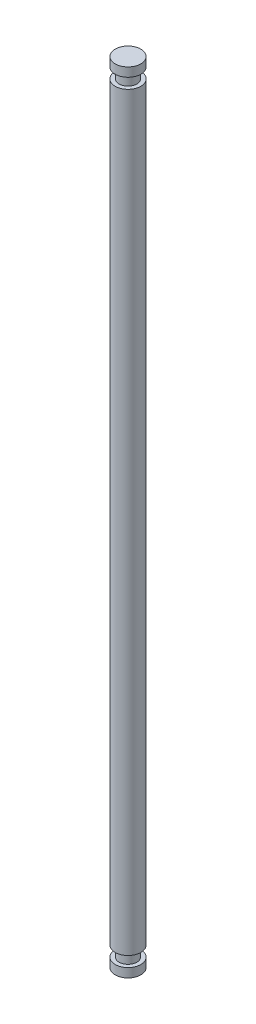
ISO-10303-21;
HEADER;
FILE_DESCRIPTION(('STEP AP214'),'2;1');
FILE_NAME('part.step','',(''),(''),'','','');
FILE_SCHEMA(('AUTOMOTIVE_DESIGN { 1 0 10303 214 1 1 1 1 }'));
ENDSEC;
DATA;
#1=APPLICATION_CONTEXT('core data for automotive mechanical design processes');
#2=APPLICATION_PROTOCOL_DEFINITION('international standard','automotive_design',2000,#1);
#3=PRODUCT_CONTEXT('',#1,'mechanical');
#4=PRODUCT('Part','Part','',(#3));
#5=PRODUCT_RELATED_PRODUCT_CATEGORY('part','',(#4));
#6=PRODUCT_DEFINITION_FORMATION('','',#4);
#7=PRODUCT_DEFINITION_CONTEXT('part definition',#1,'design');
#8=PRODUCT_DEFINITION('design','',#6,#7);
#9=PRODUCT_DEFINITION_SHAPE('','',#8);
#10=(LENGTH_UNIT() NAMED_UNIT(*) SI_UNIT(.MILLI.,.METRE.));
#11=(NAMED_UNIT(*) PLANE_ANGLE_UNIT() SI_UNIT($,.RADIAN.));
#12=(NAMED_UNIT(*) SI_UNIT($,.STERADIAN.) SOLID_ANGLE_UNIT());
#13=UNCERTAINTY_MEASURE_WITH_UNIT(LENGTH_MEASURE(1.E-05),#10,'distance_accuracy_value','');
#14=(GEOMETRIC_REPRESENTATION_CONTEXT(3) GLOBAL_UNCERTAINTY_ASSIGNED_CONTEXT((#13)) GLOBAL_UNIT_ASSIGNED_CONTEXT((#10,
#11,#12)) REPRESENTATION_CONTEXT('',''));
#15=CARTESIAN_POINT('',(0.,0.,0.));
#16=DIRECTION('',(0.,0.,1.));
#17=DIRECTION('',(1.,0.,0.));
#18=AXIS2_PLACEMENT_3D('',#15,#16,#17);
#19=CARTESIAN_POINT('',(-22.0218,-928.2176,0.));
#20=DIRECTION('',(0.,1.,0.));
#21=DIRECTION('',(0.,0.,1.));
#22=AXIS2_PLACEMENT_3D('',#19,#20,#21);
#23=PLANE('',#22);
#24=CARTESIAN_POINT('',(0.,-928.2176,0.));
#25=DIRECTION('',(0.,-1.,0.));
#26=DIRECTION('',(0.,0.,-1.));
#27=AXIS2_PLACEMENT_3D('',#24,#25,#26);
#28=CIRCLE('',#27,22.0218);
#29=CARTESIAN_POINT('',(0.,-928.2176,-22.0218));
#30=VERTEX_POINT('',#29);
#31=EDGE_CURVE('E129',#30,#30,#28,.T.);
#32=ORIENTED_EDGE('',*,*,#31,.F.);
#33=EDGE_LOOP('',(#32));
#34=FACE_BOUND('',#33,.T.);
#35=DIRECTION('',(-1.,0.,0.));
#36=VECTOR('',#35,1.);
#37=CARTESIAN_POINT('',(-24.60625,-928.2176,-6.35));
#38=LINE('',#37,#36);
#39=CARTESIAN_POINT('',(-24.60625,-928.2176,-6.35));
#40=VERTEX_POINT('',#39);
#41=CARTESIAN_POINT('',(-31.0890766653257,-928.2176,-6.35));
#42=VERTEX_POINT('',#41);
#43=EDGE_CURVE('E96',#40,#42,#38,.T.);
#44=ORIENTED_EDGE('',*,*,#43,.T.);
#45=CARTESIAN_POINT('',(0.,-928.2176,0.));
#46=DIRECTION('',(0.,-1.,0.));
#47=DIRECTION('',(0.,0.,-1.));
#48=AXIS2_PLACEMENT_3D('',#45,#46,#47);
#49=CIRCLE('',#48,31.73095);
#50=CARTESIAN_POINT('',(-31.0890766653257,-928.2176,6.35));
#51=VERTEX_POINT('',#50);
#52=EDGE_CURVE('E126',#42,#51,#49,.T.);
#53=ORIENTED_EDGE('',*,*,#52,.T.);
#54=DIRECTION('',(1.,0.,0.));
#55=VECTOR('',#54,1.);
#56=CARTESIAN_POINT('',(-24.60625,-928.2176,6.35));
#57=LINE('',#56,#55);
#58=CARTESIAN_POINT('',(-24.60625,-928.2176,6.35));
#59=VERTEX_POINT('',#58);
#60=EDGE_CURVE('E92',#51,#59,#57,.T.);
#61=ORIENTED_EDGE('',*,*,#60,.T.);
#62=DIRECTION('',(0.,0.,-1.));
#63=VECTOR('',#62,1.);
#64=CARTESIAN_POINT('',(-24.60625,-928.2176,-6.35));
#65=LINE('',#64,#63);
#66=EDGE_CURVE('E105',#59,#40,#65,.T.);
#67=ORIENTED_EDGE('',*,*,#66,.T.);
#68=EDGE_LOOP('',(#44,#53,#61,#67));
#69=FACE_BOUND('',#68,.T.);
#70=ADVANCED_FACE('F43',(#34,#69),#23,.F.);
#71=CARTESIAN_POINT('',(0.,-1001.776,0.));
#72=DIRECTION('',(0.,-1.,0.));
#73=DIRECTION('',(0.,0.,-1.));
#74=AXIS2_PLACEMENT_3D('',#71,#72,#73);
#75=CYLINDRICAL_SURFACE('',#74,31.73095);
#76=DIRECTION('',(0.,-1.,0.));
#77=VECTOR('',#76,1.);
#78=CARTESIAN_POINT('',(-31.0890766653257,-1001.776,-6.35));
#79=LINE('',#78,#77);
#80=CARTESIAN_POINT('',(-31.0890766653257,928.3446,-6.35));
#81=VERTEX_POINT('',#80);
#82=EDGE_CURVE('E111',#81,#42,#79,.T.);
#83=ORIENTED_EDGE('',*,*,#82,.F.);
#84=CARTESIAN_POINT('',(0.,928.3446,0.));
#85=DIRECTION('',(0.,-1.,0.));
#86=DIRECTION('',(0.,0.,-1.));
#87=AXIS2_PLACEMENT_3D('',#84,#85,#86);
#88=CIRCLE('',#87,31.73095);
#89=CARTESIAN_POINT('',(-31.0890766653257,928.3446,6.35));
#90=VERTEX_POINT('',#89);
#91=EDGE_CURVE('E101',#81,#90,#88,.T.);
#92=ORIENTED_EDGE('',*,*,#91,.T.);
#93=DIRECTION('',(0.,-1.,0.));
#94=VECTOR('',#93,1.);
#95=CARTESIAN_POINT('',(-31.0890766653257,-1001.776,6.35));
#96=LINE('',#95,#94);
#97=EDGE_CURVE('E57',#51,#90,#96,.F.);
#98=ORIENTED_EDGE('',*,*,#97,.F.);
#99=ORIENTED_EDGE('',*,*,#52,.F.);
#100=EDGE_LOOP('',(#83,#92,#98,#99));
#101=FACE_BOUND('',#100,.T.);
#102=ADVANCED_FACE('F161',(#101),#75,.T.);
#103=CARTESIAN_POINT('',(-31.73095,928.3446,0.));
#104=DIRECTION('',(0.,-1.,0.));
#105=DIRECTION('',(0.,0.,-1.));
#106=AXIS2_PLACEMENT_3D('',#103,#104,#105);
#107=PLANE('',#106);
#108=CARTESIAN_POINT('',(0.,928.3446,0.));
#109=DIRECTION('',(0.,-1.,0.));
#110=DIRECTION('',(0.,0.,-1.));
#111=AXIS2_PLACEMENT_3D('',#108,#109,#110);
#112=CIRCLE('',#111,22.0218);
#113=CARTESIAN_POINT('',(0.,928.3446,-22.0218));
#114=VERTEX_POINT('',#113);
#115=EDGE_CURVE('E122',#114,#114,#112,.T.);
#116=ORIENTED_EDGE('',*,*,#115,.T.);
#117=EDGE_LOOP('',(#116));
#118=FACE_BOUND('',#117,.T.);
#119=DIRECTION('',(-1.,0.,0.));
#120=VECTOR('',#119,1.);
#121=CARTESIAN_POINT('',(-24.60625,928.3446,-6.35));
#122=LINE('',#121,#120);
#123=CARTESIAN_POINT('',(-24.60625,928.3446,-6.35));
#124=VERTEX_POINT('',#123);
#125=EDGE_CURVE('E65',#124,#81,#122,.T.);
#126=ORIENTED_EDGE('',*,*,#125,.F.);
#127=DIRECTION('',(0.,0.,-1.));
#128=VECTOR('',#127,1.);
#129=CARTESIAN_POINT('',(-24.60625,928.3446,-6.35));
#130=LINE('',#129,#128);
#131=CARTESIAN_POINT('',(-24.60625,928.3446,6.35));
#132=VERTEX_POINT('',#131);
#133=EDGE_CURVE('E85',#132,#124,#130,.T.);
#134=ORIENTED_EDGE('',*,*,#133,.F.);
#135=DIRECTION('',(1.,0.,0.));
#136=VECTOR('',#135,1.);
#137=CARTESIAN_POINT('',(-31.73095,928.3446,6.35));
#138=LINE('',#137,#136);
#139=EDGE_CURVE('E11',#90,#132,#138,.T.);
#140=ORIENTED_EDGE('',*,*,#139,.F.);
#141=ORIENTED_EDGE('',*,*,#91,.F.);
#142=EDGE_LOOP('',(#126,#134,#140,#141));
#143=FACE_BOUND('',#142,.T.);
#144=ADVANCED_FACE('F99',(#118,#143),#107,.F.);
#145=CARTESIAN_POINT('',(0.,-976.376,0.));
#146=DIRECTION('',(0.,1.,0.));
#147=DIRECTION('',(0.,0.,1.));
#148=AXIS2_PLACEMENT_3D('',#145,#146,#147);
#149=PLANE('',#148);
#150=CARTESIAN_POINT('',(0.,-976.376,0.));
#151=DIRECTION('',(0.,-1.,0.));
#152=DIRECTION('',(0.,0.,-1.));
#153=AXIS2_PLACEMENT_3D('',#150,#151,#152);
#154=CIRCLE('',#153,31.73095);
#155=CARTESIAN_POINT('',(0.,-976.376,-31.73095));
#156=VERTEX_POINT('',#155);
#157=EDGE_CURVE('E51',#156,#156,#154,.T.);
#158=ORIENTED_EDGE('',*,*,#157,.T.);
#159=EDGE_LOOP('',(#158));
#160=FACE_BOUND('',#159,.T.);
#161=ADVANCED_FACE('F45',(#160),#149,.F.);
#162=CARTESIAN_POINT('',(0.,-1001.776,0.));
#163=DIRECTION('',(0.,-1.,0.));
#164=DIRECTION('',(0.,0.,-1.));
#165=AXIS2_PLACEMENT_3D('',#162,#163,#164);
#166=CYLINDRICAL_SURFACE('',#165,31.73095);
#167=ORIENTED_EDGE('',*,*,#157,.F.);
#168=EDGE_LOOP('',(#167));
#169=FACE_BOUND('',#168,.T.);
#170=CARTESIAN_POINT('',(0.,-954.024,0.));
#171=DIRECTION('',(0.,-1.,0.));
#172=DIRECTION('',(0.,0.,-1.));
#173=AXIS2_PLACEMENT_3D('',#170,#171,#172);
#174=CIRCLE('',#173,31.73095);
#175=CARTESIAN_POINT('',(0.,-954.024,-31.73095));
#176=VERTEX_POINT('',#175);
#177=EDGE_CURVE('E135',#176,#176,#174,.T.);
#178=ORIENTED_EDGE('',*,*,#177,.T.);
#179=EDGE_LOOP('',(#178));
#180=FACE_BOUND('',#179,.T.);
#181=ADVANCED_FACE('F141',(#169,#180),#166,.T.);
#182=CARTESIAN_POINT('',(-31.73095,-954.024,0.));
#183=DIRECTION('',(0.,-1.,0.));
#184=DIRECTION('',(0.,0.,-1.));
#185=AXIS2_PLACEMENT_3D('',#182,#183,#184);
#186=PLANE('',#185);
#187=ORIENTED_EDGE('',*,*,#177,.F.);
#188=EDGE_LOOP('',(#187));
#189=FACE_BOUND('',#188,.T.);
#190=CARTESIAN_POINT('',(0.,-954.024,0.));
#191=DIRECTION('',(0.,-1.,0.));
#192=DIRECTION('',(0.,0.,-1.));
#193=AXIS2_PLACEMENT_3D('',#190,#191,#192);
#194=CIRCLE('',#193,22.0218);
#195=CARTESIAN_POINT('',(0.,-954.024,-22.0218));
#196=VERTEX_POINT('',#195);
#197=EDGE_CURVE('E132',#196,#196,#194,.T.);
#198=ORIENTED_EDGE('',*,*,#197,.T.);
#199=EDGE_LOOP('',(#198));
#200=FACE_BOUND('',#199,.T.);
#201=ADVANCED_FACE('F144',(#189,#200),#186,.F.);
#202=CARTESIAN_POINT('',(0.,-1001.776,0.));
#203=DIRECTION('',(0.,-1.,0.));
#204=DIRECTION('',(0.,0.,-1.));
#205=AXIS2_PLACEMENT_3D('',#202,#203,#204);
#206=CYLINDRICAL_SURFACE('',#205,22.0218);
#207=ORIENTED_EDGE('',*,*,#197,.F.);
#208=EDGE_LOOP('',(#207));
#209=FACE_BOUND('',#208,.T.);
#210=ORIENTED_EDGE('',*,*,#31,.T.);
#211=EDGE_LOOP('',(#210));
#212=FACE_BOUND('',#211,.T.);
#213=ADVANCED_FACE('F149',(#209,#212),#206,.T.);
#214=CARTESIAN_POINT('',(0.,-1001.776,0.));
#215=DIRECTION('',(0.,-1.,0.));
#216=DIRECTION('',(0.,0.,-1.));
#217=AXIS2_PLACEMENT_3D('',#214,#215,#216);
#218=CYLINDRICAL_SURFACE('',#217,22.0218);
#219=ORIENTED_EDGE('',*,*,#115,.F.);
#220=EDGE_LOOP('',(#219));
#221=FACE_BOUND('',#220,.T.);
#222=CARTESIAN_POINT('',(0.,954.151,0.));
#223=DIRECTION('',(0.,-1.,0.));
#224=DIRECTION('',(0.,0.,-1.));
#225=AXIS2_PLACEMENT_3D('',#222,#223,#224);
#226=CIRCLE('',#225,22.0218);
#227=CARTESIAN_POINT('',(0.,954.151,-22.0218));
#228=VERTEX_POINT('',#227);
#229=EDGE_CURVE('E119',#228,#228,#226,.T.);
#230=ORIENTED_EDGE('',*,*,#229,.T.);
#231=EDGE_LOOP('',(#230));
#232=FACE_BOUND('',#231,.T.);
#233=ADVANCED_FACE('F155',(#221,#232),#218,.T.);
#234=CARTESIAN_POINT('',(-22.0218,954.151,0.));
#235=DIRECTION('',(0.,1.,0.));
#236=DIRECTION('',(0.,0.,1.));
#237=AXIS2_PLACEMENT_3D('',#234,#235,#236);
#238=PLANE('',#237);
#239=ORIENTED_EDGE('',*,*,#229,.F.);
#240=EDGE_LOOP('',(#239));
#241=FACE_BOUND('',#240,.T.);
#242=CARTESIAN_POINT('',(0.,954.151,0.));
#243=DIRECTION('',(0.,-1.,0.));
#244=DIRECTION('',(0.,0.,-1.));
#245=AXIS2_PLACEMENT_3D('',#242,#243,#244);
#246=CIRCLE('',#245,31.73095);
#247=CARTESIAN_POINT('',(0.,954.151,-31.73095));
#248=VERTEX_POINT('',#247);
#249=EDGE_CURVE('E116',#248,#248,#246,.T.);
#250=ORIENTED_EDGE('',*,*,#249,.T.);
#251=EDGE_LOOP('',(#250));
#252=FACE_BOUND('',#251,.T.);
#253=ADVANCED_FACE('F175',(#241,#252),#238,.F.);
#254=CARTESIAN_POINT('',(0.,-1001.776,0.));
#255=DIRECTION('',(0.,-1.,0.));
#256=DIRECTION('',(0.,0.,-1.));
#257=AXIS2_PLACEMENT_3D('',#254,#255,#256);
#258=CYLINDRICAL_SURFACE('',#257,31.73095);
#259=ORIENTED_EDGE('',*,*,#249,.F.);
#260=EDGE_LOOP('',(#259));
#261=FACE_BOUND('',#260,.T.);
#262=CARTESIAN_POINT('',(0.,976.376,0.));
#263=DIRECTION('',(0.,-1.,0.));
#264=DIRECTION('',(0.,0.,-1.));
#265=AXIS2_PLACEMENT_3D('',#262,#263,#264);
#266=CIRCLE('',#265,31.73095);
#267=CARTESIAN_POINT('',(0.,976.376,-31.73095));
#268=VERTEX_POINT('',#267);
#269=EDGE_CURVE('E113',#268,#268,#266,.T.);
#270=ORIENTED_EDGE('',*,*,#269,.T.);
#271=EDGE_LOOP('',(#270));
#272=FACE_BOUND('',#271,.T.);
#273=ADVANCED_FACE('F179',(#261,#272),#258,.T.);
#274=CARTESIAN_POINT('',(-31.73095,976.376,0.));
#275=DIRECTION('',(0.,-1.,0.));
#276=DIRECTION('',(0.,0.,-1.));
#277=AXIS2_PLACEMENT_3D('',#274,#275,#276);
#278=PLANE('',#277);
#279=ORIENTED_EDGE('',*,*,#269,.F.);
#280=EDGE_LOOP('',(#279));
#281=FACE_BOUND('',#280,.T.);
#282=ADVANCED_FACE('F183',(#281),#278,.F.);
#283=CARTESIAN_POINT('',(-24.60625,928.3446,-6.35));
#284=DIRECTION('',(0.,0.,1.));
#285=DIRECTION('',(1.,0.,0.));
#286=AXIS2_PLACEMENT_3D('',#283,#284,#285);
#287=PLANE('',#286);
#288=ORIENTED_EDGE('',*,*,#82,.T.);
#289=ORIENTED_EDGE('',*,*,#43,.F.);
#290=DIRECTION('',(0.,-1.,0.));
#291=VECTOR('',#290,1.);
#292=CARTESIAN_POINT('',(-24.60625,928.3446,-6.35));
#293=LINE('',#292,#291);
#294=EDGE_CURVE('E88',#124,#40,#293,.T.);
#295=ORIENTED_EDGE('',*,*,#294,.F.);
#296=ORIENTED_EDGE('',*,*,#125,.T.);
#297=EDGE_LOOP('',(#288,#289,#295,#296));
#298=FACE_BOUND('',#297,.T.);
#299=ADVANCED_FACE('F94',(#298),#287,.T.);
#300=CARTESIAN_POINT('',(-24.60625,928.3446,6.35));
#301=DIRECTION('',(0.,0.,-1.));
#302=DIRECTION('',(-1.,0.,0.));
#303=AXIS2_PLACEMENT_3D('',#300,#301,#302);
#304=PLANE('',#303);
#305=ORIENTED_EDGE('',*,*,#97,.T.);
#306=ORIENTED_EDGE('',*,*,#139,.T.);
#307=DIRECTION('',(0.,-1.,0.));
#308=VECTOR('',#307,1.);
#309=CARTESIAN_POINT('',(-24.60625,928.3446,6.35));
#310=LINE('',#309,#308);
#311=EDGE_CURVE('E90',#132,#59,#310,.T.);
#312=ORIENTED_EDGE('',*,*,#311,.T.);
#313=ORIENTED_EDGE('',*,*,#60,.F.);
#314=EDGE_LOOP('',(#305,#306,#312,#313));
#315=FACE_BOUND('',#314,.T.);
#316=ADVANCED_FACE('F190',(#315),#304,.T.);
#317=CARTESIAN_POINT('',(-24.60625,928.3446,-6.35));
#318=DIRECTION('',(-1.,0.,0.));
#319=DIRECTION('',(0.,0.,1.));
#320=AXIS2_PLACEMENT_3D('',#317,#318,#319);
#321=PLANE('',#320);
#322=ORIENTED_EDGE('',*,*,#66,.F.);
#323=ORIENTED_EDGE('',*,*,#311,.F.);
#324=ORIENTED_EDGE('',*,*,#133,.T.);
#325=ORIENTED_EDGE('',*,*,#294,.T.);
#326=EDGE_LOOP('',(#322,#323,#324,#325));
#327=FACE_BOUND('',#326,.T.);
#328=ADVANCED_FACE('F87',(#327),#321,.T.);
#329=CLOSED_SHELL('',(#70,#102,#144,#161,#181,#201,#213,#233,#253,#273,#282,#299,#316,#328));
#330=MANIFOLD_SOLID_BREP('B2',#329);
#331=ADVANCED_BREP_SHAPE_REPRESENTATION('',(#18,#330),#14);
#332=SHAPE_DEFINITION_REPRESENTATION(#9,#331);
ENDSEC;
END-ISO-10303-21;
